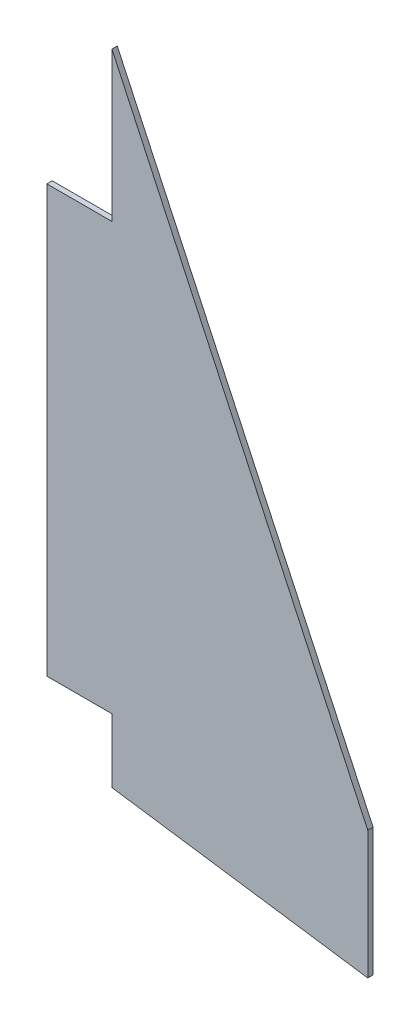
ISO-10303-21;
HEADER;
FILE_DESCRIPTION(('STEP AP214'),'2;1');
FILE_NAME('part.step','',(''),(''),'','','');
FILE_SCHEMA(('AUTOMOTIVE_DESIGN { 1 0 10303 214 1 1 1 1 }'));
ENDSEC;
DATA;
#1=APPLICATION_CONTEXT('core data for automotive mechanical design processes');
#2=APPLICATION_PROTOCOL_DEFINITION('international standard','automotive_design',2000,#1);
#3=PRODUCT_CONTEXT('',#1,'mechanical');
#4=PRODUCT('Part','Part','',(#3));
#5=PRODUCT_RELATED_PRODUCT_CATEGORY('part','',(#4));
#6=PRODUCT_DEFINITION_FORMATION('','',#4);
#7=PRODUCT_DEFINITION_CONTEXT('part definition',#1,'design');
#8=PRODUCT_DEFINITION('design','',#6,#7);
#9=PRODUCT_DEFINITION_SHAPE('','',#8);
#10=(LENGTH_UNIT() NAMED_UNIT(*) SI_UNIT(.MILLI.,.METRE.));
#11=(NAMED_UNIT(*) PLANE_ANGLE_UNIT() SI_UNIT($,.RADIAN.));
#12=(NAMED_UNIT(*) SI_UNIT($,.STERADIAN.) SOLID_ANGLE_UNIT());
#13=UNCERTAINTY_MEASURE_WITH_UNIT(LENGTH_MEASURE(1.E-05),#10,'distance_accuracy_value','');
#14=(GEOMETRIC_REPRESENTATION_CONTEXT(3) GLOBAL_UNCERTAINTY_ASSIGNED_CONTEXT((#13)) GLOBAL_UNIT_ASSIGNED_CONTEXT((#10,
#11,#12)) REPRESENTATION_CONTEXT('',''));
#15=CARTESIAN_POINT('',(0.,0.,0.));
#16=DIRECTION('',(0.,0.,1.));
#17=DIRECTION('',(1.,0.,0.));
#18=AXIS2_PLACEMENT_3D('',#15,#16,#17);
#19=CARTESIAN_POINT('',(0.,0.,3.175));
#20=DIRECTION('',(1.,0.,0.));
#21=DIRECTION('',(0.,0.,-1.));
#22=AXIS2_PLACEMENT_3D('',#19,#20,#21);
#23=PLANE('',#22);
#24=DIRECTION('',(0.,0.,1.));
#25=VECTOR('',#24,1.);
#26=CARTESIAN_POINT('',(0.,38.1,-256.936568485298));
#27=LINE('',#26,#25);
#28=CARTESIAN_POINT('',(0.,38.1,0.));
#29=VERTEX_POINT('',#28);
#30=CARTESIAN_POINT('',(0.,38.1,3.175));
#31=VERTEX_POINT('',#30);
#32=EDGE_CURVE('E147',#29,#31,#27,.T.);
#33=ORIENTED_EDGE('',*,*,#32,.F.);
#34=DIRECTION('',(0.,-1.,0.));
#35=VECTOR('',#34,1.);
#36=CARTESIAN_POINT('',(0.,0.,0.));
#37=LINE('',#36,#35);
#38=CARTESIAN_POINT('',(0.,0.,0.));
#39=VERTEX_POINT('',#38);
#40=EDGE_CURVE('E86',#29,#39,#37,.T.);
#41=ORIENTED_EDGE('',*,*,#40,.T.);
#42=DIRECTION('',(0.,0.,-1.));
#43=VECTOR('',#42,1.);
#44=CARTESIAN_POINT('',(0.,0.,3.175));
#45=LINE('',#44,#43);
#46=CARTESIAN_POINT('',(0.,0.,3.175));
#47=VERTEX_POINT('',#46);
#48=EDGE_CURVE('E169',#47,#39,#45,.T.);
#49=ORIENTED_EDGE('',*,*,#48,.F.);
#50=DIRECTION('',(0.,-1.,0.));
#51=VECTOR('',#50,1.);
#52=CARTESIAN_POINT('',(0.,0.,3.175));
#53=LINE('',#52,#51);
#54=EDGE_CURVE('E64',#31,#47,#53,.T.);
#55=ORIENTED_EDGE('',*,*,#54,.F.);
#56=EDGE_LOOP('',(#33,#41,#49,#55));
#57=FACE_BOUND('',#56,.T.);
#58=ADVANCED_FACE('F39',(#57),#23,.F.);
#59=CARTESIAN_POINT('',(152.4,-22.0228546856589,3.175));
#60=DIRECTION('',(0.143021332428781,0.989719605984592,0.));
#61=DIRECTION('',(-0.989719605984592,0.143021332428781,0.));
#62=AXIS2_PLACEMENT_3D('',#59,#60,#61);
#63=PLANE('',#62);
#64=DIRECTION('',(0.989719605984592,-0.143021332428781,0.));
#65=VECTOR('',#64,1.);
#66=CARTESIAN_POINT('',(152.4,-22.0228546856589,0.));
#67=LINE('',#66,#65);
#68=CARTESIAN_POINT('',(152.4,-22.0228546856589,0.));
#69=VERTEX_POINT('',#68);
#70=EDGE_CURVE('E155',#39,#69,#67,.T.);
#71=ORIENTED_EDGE('',*,*,#70,.T.);
#72=DIRECTION('',(0.,0.,-1.));
#73=VECTOR('',#72,1.);
#74=CARTESIAN_POINT('',(152.4,-22.0228546856589,3.175));
#75=LINE('',#74,#73);
#76=CARTESIAN_POINT('',(152.4,-22.0228546856589,3.175));
#77=VERTEX_POINT('',#76);
#78=EDGE_CURVE('E11',#77,#69,#75,.T.);
#79=ORIENTED_EDGE('',*,*,#78,.F.);
#80=DIRECTION('',(0.989719605984592,-0.143021332428781,0.));
#81=VECTOR('',#80,1.);
#82=CARTESIAN_POINT('',(152.4,-22.0228546856589,3.175));
#83=LINE('',#82,#81);
#84=EDGE_CURVE('E156',#47,#77,#83,.T.);
#85=ORIENTED_EDGE('',*,*,#84,.F.);
#86=ORIENTED_EDGE('',*,*,#48,.T.);
#87=EDGE_LOOP('',(#71,#79,#85,#86));
#88=FACE_BOUND('',#87,.T.);
#89=ADVANCED_FACE('F41',(#88),#63,.F.);
#90=CARTESIAN_POINT('',(152.4,54.1771453143411,3.175));
#91=DIRECTION('',(-1.,0.,0.));
#92=DIRECTION('',(0.,0.,1.));
#93=AXIS2_PLACEMENT_3D('',#90,#91,#92);
#94=PLANE('',#93);
#95=DIRECTION('',(0.,1.,0.));
#96=VECTOR('',#95,1.);
#97=CARTESIAN_POINT('',(152.4,54.1771453143411,0.));
#98=LINE('',#97,#96);
#99=CARTESIAN_POINT('',(152.4,54.1771453143411,0.));
#100=VERTEX_POINT('',#99);
#101=EDGE_CURVE('E173',#69,#100,#98,.T.);
#102=ORIENTED_EDGE('',*,*,#101,.T.);
#103=DIRECTION('',(0.,0.,-1.));
#104=VECTOR('',#103,1.);
#105=CARTESIAN_POINT('',(152.4,54.1771453143411,3.175));
#106=LINE('',#105,#104);
#107=CARTESIAN_POINT('',(152.4,54.1771453143411,3.175));
#108=VERTEX_POINT('',#107);
#109=EDGE_CURVE('E48',#108,#100,#106,.T.);
#110=ORIENTED_EDGE('',*,*,#109,.F.);
#111=DIRECTION('',(0.,1.,0.));
#112=VECTOR('',#111,1.);
#113=CARTESIAN_POINT('',(152.4,54.1771453143411,3.175));
#114=LINE('',#113,#112);
#115=EDGE_CURVE('E93',#77,#108,#114,.T.);
#116=ORIENTED_EDGE('',*,*,#115,.F.);
#117=ORIENTED_EDGE('',*,*,#78,.T.);
#118=EDGE_LOOP('',(#102,#110,#116,#117));
#119=FACE_BOUND('',#118,.T.);
#120=ADVANCED_FACE('F200',(#119),#94,.F.);
#121=CARTESIAN_POINT('',(0.,381.,3.175));
#122=DIRECTION('',(-0.906307787036651,-0.422618261740697,0.));
#123=DIRECTION('',(0.422618261740697,-0.906307787036651,0.));
#124=AXIS2_PLACEMENT_3D('',#121,#122,#123);
#125=PLANE('',#124);
#126=DIRECTION('',(-0.422618261740697,0.906307787036651,0.));
#127=VECTOR('',#126,1.);
#128=CARTESIAN_POINT('',(0.,381.,0.));
#129=LINE('',#128,#127);
#130=CARTESIAN_POINT('',(0.,381.,0.));
#131=VERTEX_POINT('',#130);
#132=EDGE_CURVE('E176',#100,#131,#129,.T.);
#133=ORIENTED_EDGE('',*,*,#132,.T.);
#134=DIRECTION('',(0.,0.,-1.));
#135=VECTOR('',#134,1.);
#136=CARTESIAN_POINT('',(0.,381.,3.175));
#137=LINE('',#136,#135);
#138=CARTESIAN_POINT('',(0.,381.,3.175));
#139=VERTEX_POINT('',#138);
#140=EDGE_CURVE('E183',#139,#131,#137,.T.);
#141=ORIENTED_EDGE('',*,*,#140,.F.);
#142=DIRECTION('',(-0.422618261740697,0.906307787036651,0.));
#143=VECTOR('',#142,1.);
#144=CARTESIAN_POINT('',(0.,381.,3.175));
#145=LINE('',#144,#143);
#146=EDGE_CURVE('E162',#108,#139,#145,.T.);
#147=ORIENTED_EDGE('',*,*,#146,.F.);
#148=ORIENTED_EDGE('',*,*,#109,.T.);
#149=EDGE_LOOP('',(#133,#141,#147,#148));
#150=FACE_BOUND('',#149,.T.);
#151=ADVANCED_FACE('F191',(#150),#125,.F.);
#152=CARTESIAN_POINT('',(0.,292.1,0.));
#153=VERTEX_POINT('',#152);
#154=EDGE_CURVE('E159',#131,#153,#37,.T.);
#155=ORIENTED_EDGE('',*,*,#154,.T.);
#156=DIRECTION('',(0.,0.,1.));
#157=VECTOR('',#156,1.);
#158=CARTESIAN_POINT('',(0.,292.1,-256.936568485298));
#159=LINE('',#158,#157);
#160=CARTESIAN_POINT('',(0.,292.1,3.175));
#161=VERTEX_POINT('',#160);
#162=EDGE_CURVE('E136',#153,#161,#159,.T.);
#163=ORIENTED_EDGE('',*,*,#162,.T.);
#164=EDGE_CURVE('E165',#139,#161,#53,.T.);
#165=ORIENTED_EDGE('',*,*,#164,.F.);
#166=ORIENTED_EDGE('',*,*,#140,.T.);
#167=EDGE_LOOP('',(#155,#163,#165,#166));
#168=FACE_BOUND('',#167,.T.);
#169=ADVANCED_FACE('F194',(#168),#23,.F.);
#170=CARTESIAN_POINT('',(0.,0.,3.175));
#171=DIRECTION('',(0.,0.,-1.));
#172=DIRECTION('',(-1.,0.,0.));
#173=AXIS2_PLACEMENT_3D('',#170,#171,#172);
#174=PLANE('',#173);
#175=ORIENTED_EDGE('',*,*,#84,.T.);
#176=ORIENTED_EDGE('',*,*,#115,.T.);
#177=ORIENTED_EDGE('',*,*,#146,.T.);
#178=ORIENTED_EDGE('',*,*,#164,.T.);
#179=DIRECTION('',(-1.,0.,0.));
#180=VECTOR('',#179,1.);
#181=CARTESIAN_POINT('',(0.,292.1,3.175));
#182=LINE('',#181,#180);
#183=CARTESIAN_POINT('',(-38.735,292.1,3.175));
#184=VERTEX_POINT('',#183);
#185=EDGE_CURVE('E55',#161,#184,#182,.T.);
#186=ORIENTED_EDGE('',*,*,#185,.T.);
#187=DIRECTION('',(0.,-1.,0.));
#188=VECTOR('',#187,1.);
#189=CARTESIAN_POINT('',(-38.735,292.1,3.175));
#190=LINE('',#189,#188);
#191=CARTESIAN_POINT('',(-38.735,38.1,3.175));
#192=VERTEX_POINT('',#191);
#193=EDGE_CURVE('E132',#184,#192,#190,.T.);
#194=ORIENTED_EDGE('',*,*,#193,.T.);
#195=DIRECTION('',(1.,0.,0.));
#196=VECTOR('',#195,1.);
#197=CARTESIAN_POINT('',(0.,38.1,3.175));
#198=LINE('',#197,#196);
#199=EDGE_CURVE('E139',#192,#31,#198,.T.);
#200=ORIENTED_EDGE('',*,*,#199,.T.);
#201=ORIENTED_EDGE('',*,*,#54,.T.);
#202=EDGE_LOOP('',(#175,#176,#177,#178,#186,#194,#200,#201));
#203=FACE_BOUND('',#202,.T.);
#204=ADVANCED_FACE('F196',(#203),#174,.F.);
#205=CARTESIAN_POINT('',(0.,0.,0.));
#206=DIRECTION('',(0.,0.,-1.));
#207=DIRECTION('',(-1.,0.,0.));
#208=AXIS2_PLACEMENT_3D('',#205,#206,#207);
#209=PLANE('',#208);
#210=ORIENTED_EDGE('',*,*,#70,.F.);
#211=ORIENTED_EDGE('',*,*,#40,.F.);
#212=DIRECTION('',(1.,0.,0.));
#213=VECTOR('',#212,1.);
#214=CARTESIAN_POINT('',(0.,38.1,0.));
#215=LINE('',#214,#213);
#216=CARTESIAN_POINT('',(-38.735,38.1,0.));
#217=VERTEX_POINT('',#216);
#218=EDGE_CURVE('E122',#217,#29,#215,.T.);
#219=ORIENTED_EDGE('',*,*,#218,.F.);
#220=DIRECTION('',(0.,-1.,0.));
#221=VECTOR('',#220,1.);
#222=CARTESIAN_POINT('',(-38.735,292.1,0.));
#223=LINE('',#222,#221);
#224=CARTESIAN_POINT('',(-38.735,292.1,0.));
#225=VERTEX_POINT('',#224);
#226=EDGE_CURVE('E115',#225,#217,#223,.T.);
#227=ORIENTED_EDGE('',*,*,#226,.F.);
#228=DIRECTION('',(-1.,0.,0.));
#229=VECTOR('',#228,1.);
#230=CARTESIAN_POINT('',(0.,292.1,0.));
#231=LINE('',#230,#229);
#232=EDGE_CURVE('E121',#153,#225,#231,.T.);
#233=ORIENTED_EDGE('',*,*,#232,.F.);
#234=ORIENTED_EDGE('',*,*,#154,.F.);
#235=ORIENTED_EDGE('',*,*,#132,.F.);
#236=ORIENTED_EDGE('',*,*,#101,.F.);
#237=EDGE_LOOP('',(#210,#211,#219,#227,#233,#234,#235,#236));
#238=FACE_BOUND('',#237,.T.);
#239=ADVANCED_FACE('F118',(#238),#209,.T.);
#240=CARTESIAN_POINT('',(0.,292.1,-256.936568485298));
#241=DIRECTION('',(0.,1.,0.));
#242=DIRECTION('',(0.,0.,1.));
#243=AXIS2_PLACEMENT_3D('',#240,#241,#242);
#244=PLANE('',#243);
#245=ORIENTED_EDGE('',*,*,#162,.F.);
#246=ORIENTED_EDGE('',*,*,#232,.T.);
#247=DIRECTION('',(0.,0.,1.));
#248=VECTOR('',#247,1.);
#249=CARTESIAN_POINT('',(-38.735,292.1,-256.936568485298));
#250=LINE('',#249,#248);
#251=EDGE_CURVE('E127',#225,#184,#250,.T.);
#252=ORIENTED_EDGE('',*,*,#251,.T.);
#253=ORIENTED_EDGE('',*,*,#185,.F.);
#254=EDGE_LOOP('',(#245,#246,#252,#253));
#255=FACE_BOUND('',#254,.T.);
#256=ADVANCED_FACE('F135',(#255),#244,.T.);
#257=CARTESIAN_POINT('',(-38.735,292.1,-256.936568485298));
#258=DIRECTION('',(-1.,0.,0.));
#259=DIRECTION('',(0.,-1.,0.));
#260=AXIS2_PLACEMENT_3D('',#257,#258,#259);
#261=PLANE('',#260);
#262=ORIENTED_EDGE('',*,*,#251,.F.);
#263=ORIENTED_EDGE('',*,*,#226,.T.);
#264=DIRECTION('',(0.,0.,1.));
#265=VECTOR('',#264,1.);
#266=CARTESIAN_POINT('',(-38.735,38.1,-256.936568485298));
#267=LINE('',#266,#265);
#268=EDGE_CURVE('E126',#217,#192,#267,.T.);
#269=ORIENTED_EDGE('',*,*,#268,.T.);
#270=ORIENTED_EDGE('',*,*,#193,.F.);
#271=EDGE_LOOP('',(#262,#263,#269,#270));
#272=FACE_BOUND('',#271,.T.);
#273=ADVANCED_FACE('F130',(#272),#261,.T.);
#274=CARTESIAN_POINT('',(0.,38.1,-256.936568485298));
#275=DIRECTION('',(0.,-1.,0.));
#276=DIRECTION('',(1.,0.,0.));
#277=AXIS2_PLACEMENT_3D('',#274,#275,#276);
#278=PLANE('',#277);
#279=ORIENTED_EDGE('',*,*,#268,.F.);
#280=ORIENTED_EDGE('',*,*,#218,.T.);
#281=ORIENTED_EDGE('',*,*,#32,.T.);
#282=ORIENTED_EDGE('',*,*,#199,.F.);
#283=EDGE_LOOP('',(#279,#280,#281,#282));
#284=FACE_BOUND('',#283,.T.);
#285=ADVANCED_FACE('F225',(#284),#278,.T.);
#286=CLOSED_SHELL('',(#58,#89,#120,#151,#169,#204,#239,#256,#273,#285));
#287=MANIFOLD_SOLID_BREP('B2',#286);
#288=ADVANCED_BREP_SHAPE_REPRESENTATION('',(#18,#287),#14);
#289=SHAPE_DEFINITION_REPRESENTATION(#9,#288);
ENDSEC;
END-ISO-10303-21;
